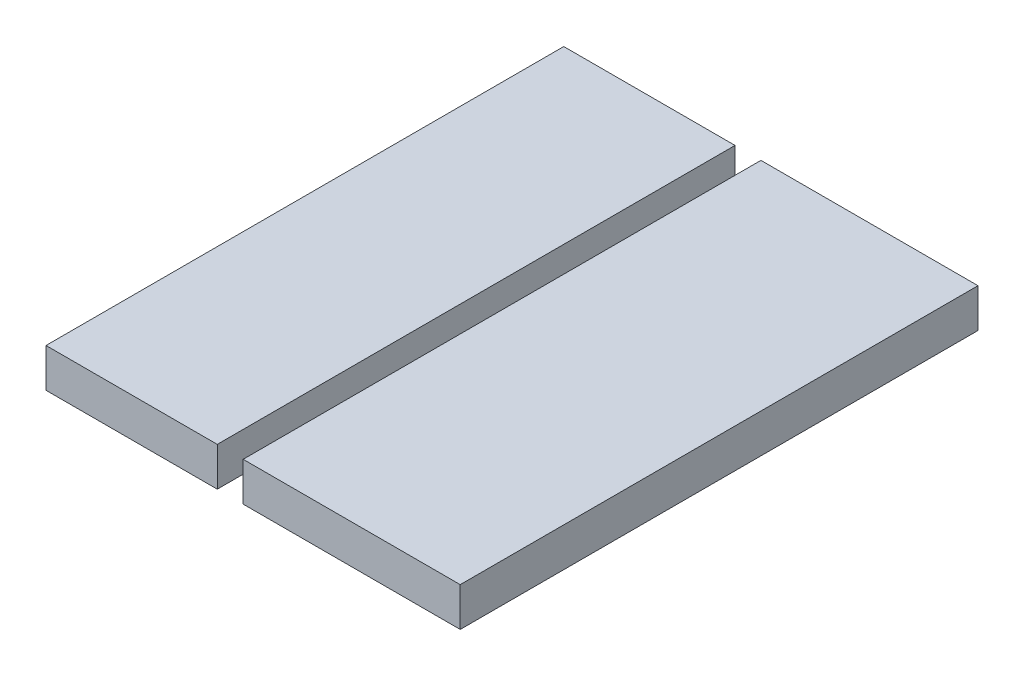
ISO-10303-21;
HEADER;
FILE_DESCRIPTION(('STEP AP214'),'2;1');
FILE_NAME('part.step','',(''),(''),'','','');
FILE_SCHEMA(('AUTOMOTIVE_DESIGN { 1 0 10303 214 1 1 1 1 }'));
ENDSEC;
DATA;
#1=APPLICATION_CONTEXT('core data for automotive mechanical design processes');
#2=APPLICATION_PROTOCOL_DEFINITION('international standard','automotive_design',2000,#1);
#3=PRODUCT_CONTEXT('',#1,'mechanical');
#4=PRODUCT('Part','Part','',(#3));
#5=PRODUCT_RELATED_PRODUCT_CATEGORY('part','',(#4));
#6=PRODUCT_DEFINITION_FORMATION('','',#4);
#7=PRODUCT_DEFINITION_CONTEXT('part definition',#1,'design');
#8=PRODUCT_DEFINITION('design','',#6,#7);
#9=PRODUCT_DEFINITION_SHAPE('','',#8);
#10=(LENGTH_UNIT() NAMED_UNIT(*) SI_UNIT(.MILLI.,.METRE.));
#11=(NAMED_UNIT(*) PLANE_ANGLE_UNIT() SI_UNIT($,.RADIAN.));
#12=(NAMED_UNIT(*) SI_UNIT($,.STERADIAN.) SOLID_ANGLE_UNIT());
#13=UNCERTAINTY_MEASURE_WITH_UNIT(LENGTH_MEASURE(1.E-05),#10,'distance_accuracy_value','');
#14=(GEOMETRIC_REPRESENTATION_CONTEXT(3) GLOBAL_UNCERTAINTY_ASSIGNED_CONTEXT((#13)) GLOBAL_UNIT_ASSIGNED_CONTEXT((#10,
#11,#12)) REPRESENTATION_CONTEXT('',''));
#15=CARTESIAN_POINT('',(0.,0.,0.));
#16=DIRECTION('',(0.,0.,1.));
#17=DIRECTION('',(1.,0.,0.));
#18=AXIS2_PLACEMENT_3D('',#15,#16,#17);
#19=CARTESIAN_POINT('',(28.2085642435462,4.7625,-23.1048774781914));
#20=DIRECTION('',(0.,0.,1.));
#21=DIRECTION('',(1.,0.,0.));
#22=AXIS2_PLACEMENT_3D('',#19,#20,#21);
#23=PLANE('',#22);
#24=DIRECTION('',(-1.,0.,0.));
#25=VECTOR('',#24,1.);
#26=CARTESIAN_POINT('',(28.2085642435462,4.7625,-23.1048774781914));
#27=LINE('',#26,#25);
#28=CARTESIAN_POINT('',(-1.5875,4.7625,-23.1048774781914));
#29=VERTEX_POINT('',#28);
#30=CARTESIAN_POINT('',(-22.5914357564538,4.7625,-23.1048774781914));
#31=VERTEX_POINT('',#30);
#32=EDGE_CURVE('E87',#29,#31,#27,.T.);
#33=ORIENTED_EDGE('',*,*,#32,.F.);
#34=DIRECTION('',(0.,1.,0.));
#35=VECTOR('',#34,1.);
#36=CARTESIAN_POINT('',(-1.5875,-5.2375,-23.1048774781914));
#37=LINE('',#36,#35);
#38=CARTESIAN_POINT('',(-1.5875,0.,-23.1048774781914));
#39=VERTEX_POINT('',#38);
#40=EDGE_CURVE('E51',#39,#29,#37,.T.);
#41=ORIENTED_EDGE('',*,*,#40,.F.);
#42=DIRECTION('',(-1.,0.,0.));
#43=VECTOR('',#42,1.);
#44=CARTESIAN_POINT('',(28.2085642435462,0.,-23.1048774781914));
#45=LINE('',#44,#43);
#46=CARTESIAN_POINT('',(-22.5914357564538,0.,-23.1048774781914));
#47=VERTEX_POINT('',#46);
#48=EDGE_CURVE('E45',#39,#47,#45,.T.);
#49=ORIENTED_EDGE('',*,*,#48,.T.);
#50=DIRECTION('',(0.,-1.,0.));
#51=VECTOR('',#50,1.);
#52=CARTESIAN_POINT('',(-22.5914357564538,4.7625,-23.1048774781914));
#53=LINE('',#52,#51);
#54=EDGE_CURVE('E92',#31,#47,#53,.T.);
#55=ORIENTED_EDGE('',*,*,#54,.F.);
#56=EDGE_LOOP('',(#33,#41,#49,#55));
#57=FACE_BOUND('',#56,.T.);
#58=ADVANCED_FACE('F42',(#57),#23,.F.);
#59=CARTESIAN_POINT('',(28.2085642435462,4.7625,40.3951225218086));
#60=DIRECTION('',(0.,0.,-1.));
#61=DIRECTION('',(-1.,0.,0.));
#62=AXIS2_PLACEMENT_3D('',#59,#60,#61);
#63=PLANE('',#62);
#64=DIRECTION('',(1.,0.,0.));
#65=VECTOR('',#64,1.);
#66=CARTESIAN_POINT('',(28.2085642435462,0.,40.3951225218086));
#67=LINE('',#66,#65);
#68=CARTESIAN_POINT('',(-22.5914357564538,0.,40.3951225218086));
#69=VERTEX_POINT('',#68);
#70=CARTESIAN_POINT('',(-1.5875,0.,40.3951225218086));
#71=VERTEX_POINT('',#70);
#72=EDGE_CURVE('E100',#69,#71,#67,.T.);
#73=ORIENTED_EDGE('',*,*,#72,.T.);
#74=DIRECTION('',(0.,1.,0.));
#75=VECTOR('',#74,1.);
#76=CARTESIAN_POINT('',(-1.5875,-5.2375,40.3951225218086));
#77=LINE('',#76,#75);
#78=CARTESIAN_POINT('',(-1.5875,4.7625,40.3951225218086));
#79=VERTEX_POINT('',#78);
#80=EDGE_CURVE('E58',#71,#79,#77,.T.);
#81=ORIENTED_EDGE('',*,*,#80,.T.);
#82=DIRECTION('',(1.,0.,0.));
#83=VECTOR('',#82,1.);
#84=CARTESIAN_POINT('',(28.2085642435462,4.7625,40.3951225218086));
#85=LINE('',#84,#83);
#86=CARTESIAN_POINT('',(-22.5914357564538,4.7625,40.3951225218086));
#87=VERTEX_POINT('',#86);
#88=EDGE_CURVE('E90',#87,#79,#85,.T.);
#89=ORIENTED_EDGE('',*,*,#88,.F.);
#90=DIRECTION('',(0.,-1.,0.));
#91=VECTOR('',#90,1.);
#92=CARTESIAN_POINT('',(-22.5914357564538,4.7625,40.3951225218086));
#93=LINE('',#92,#91);
#94=EDGE_CURVE('E98',#87,#69,#93,.T.);
#95=ORIENTED_EDGE('',*,*,#94,.T.);
#96=EDGE_LOOP('',(#73,#81,#89,#95));
#97=FACE_BOUND('',#96,.T.);
#98=ADVANCED_FACE('F116',(#97),#63,.F.);
#99=CARTESIAN_POINT('',(28.2085642435462,4.7625,40.3951225218086));
#100=DIRECTION('',(0.,-1.,0.));
#101=DIRECTION('',(0.,0.,-1.));
#102=AXIS2_PLACEMENT_3D('',#99,#100,#101);
#103=PLANE('',#102);
#104=ORIENTED_EDGE('',*,*,#88,.T.);
#105=DIRECTION('',(0.,0.,1.));
#106=VECTOR('',#105,1.);
#107=CARTESIAN_POINT('',(-1.5875,4.7625,-23.1048774781914));
#108=LINE('',#107,#106);
#109=EDGE_CURVE('E12',#29,#79,#108,.T.);
#110=ORIENTED_EDGE('',*,*,#109,.F.);
#111=ORIENTED_EDGE('',*,*,#32,.T.);
#112=DIRECTION('',(0.,0.,1.));
#113=VECTOR('',#112,1.);
#114=CARTESIAN_POINT('',(-22.5914357564538,4.7625,-23.1048774781914));
#115=LINE('',#114,#113);
#116=EDGE_CURVE('E94',#31,#87,#115,.T.);
#117=ORIENTED_EDGE('',*,*,#116,.T.);
#118=EDGE_LOOP('',(#104,#110,#111,#117));
#119=FACE_BOUND('',#118,.T.);
#120=ADVANCED_FACE('F86',(#119),#103,.F.);
#121=CARTESIAN_POINT('',(28.2085642435462,0.,40.3951225218086));
#122=DIRECTION('',(0.,-1.,0.));
#123=DIRECTION('',(0.,0.,-1.));
#124=AXIS2_PLACEMENT_3D('',#121,#122,#123);
#125=PLANE('',#124);
#126=DIRECTION('',(0.,0.,-1.));
#127=VECTOR('',#126,1.);
#128=CARTESIAN_POINT('',(-1.5875,0.,40.3951225218086));
#129=LINE('',#128,#127);
#130=EDGE_CURVE('E79',#71,#39,#129,.T.);
#131=ORIENTED_EDGE('',*,*,#130,.F.);
#132=ORIENTED_EDGE('',*,*,#72,.F.);
#133=DIRECTION('',(0.,0.,1.));
#134=VECTOR('',#133,1.);
#135=CARTESIAN_POINT('',(-22.5914357564538,0.,-23.1048774781914));
#136=LINE('',#135,#134);
#137=EDGE_CURVE('E96',#47,#69,#136,.T.);
#138=ORIENTED_EDGE('',*,*,#137,.F.);
#139=ORIENTED_EDGE('',*,*,#48,.F.);
#140=EDGE_LOOP('',(#131,#132,#138,#139));
#141=FACE_BOUND('',#140,.T.);
#142=ADVANCED_FACE('F112',(#141),#125,.T.);
#143=CARTESIAN_POINT('',(-22.5914357564538,4.7625,-23.1048774781914));
#144=DIRECTION('',(1.,0.,0.));
#145=DIRECTION('',(0.,0.,-1.));
#146=AXIS2_PLACEMENT_3D('',#143,#144,#145);
#147=PLANE('',#146);
#148=ORIENTED_EDGE('',*,*,#137,.T.);
#149=ORIENTED_EDGE('',*,*,#94,.F.);
#150=ORIENTED_EDGE('',*,*,#116,.F.);
#151=ORIENTED_EDGE('',*,*,#54,.T.);
#152=EDGE_LOOP('',(#148,#149,#150,#151));
#153=FACE_BOUND('',#152,.T.);
#154=ADVANCED_FACE('F109',(#153),#147,.F.);
#155=CARTESIAN_POINT('',(-1.5875,-5.2375,-23.1048774781914));
#156=DIRECTION('',(-1.,0.,0.));
#157=DIRECTION('',(0.,0.,1.));
#158=AXIS2_PLACEMENT_3D('',#155,#156,#157);
#159=PLANE('',#158);
#160=ORIENTED_EDGE('',*,*,#130,.T.);
#161=ORIENTED_EDGE('',*,*,#40,.T.);
#162=ORIENTED_EDGE('',*,*,#109,.T.);
#163=ORIENTED_EDGE('',*,*,#80,.F.);
#164=EDGE_LOOP('',(#160,#161,#162,#163));
#165=FACE_BOUND('',#164,.T.);
#166=ADVANCED_FACE('F78',(#165),#159,.F.);
#167=CLOSED_SHELL('',(#58,#98,#120,#142,#154,#166));
#168=MANIFOLD_SOLID_BREP('B2',#167);
#169=CARTESIAN_POINT('',(28.2085642435462,4.7625,-23.1048774781914));
#170=DIRECTION('',(-1.,0.,0.));
#171=DIRECTION('',(0.,0.,1.));
#172=AXIS2_PLACEMENT_3D('',#169,#170,#171);
#173=PLANE('',#172);
#174=DIRECTION('',(0.,0.,-1.));
#175=VECTOR('',#174,1.);
#176=CARTESIAN_POINT('',(28.2085642435462,0.,-23.1048774781914));
#177=LINE('',#176,#175);
#178=CARTESIAN_POINT('',(28.2085642435462,0.,40.3951225218086));
#179=VERTEX_POINT('',#178);
#180=CARTESIAN_POINT('',(28.2085642435462,0.,-23.1048774781914));
#181=VERTEX_POINT('',#180);
#182=EDGE_CURVE('E217',#179,#181,#177,.T.);
#183=ORIENTED_EDGE('',*,*,#182,.T.);
#184=DIRECTION('',(0.,-1.,0.));
#185=VECTOR('',#184,1.);
#186=CARTESIAN_POINT('',(28.2085642435462,4.7625,-23.1048774781914));
#187=LINE('',#186,#185);
#188=CARTESIAN_POINT('',(28.2085642435462,4.7625,-23.1048774781914));
#189=VERTEX_POINT('',#188);
#190=EDGE_CURVE('E173',#189,#181,#187,.T.);
#191=ORIENTED_EDGE('',*,*,#190,.F.);
#192=DIRECTION('',(0.,0.,-1.));
#193=VECTOR('',#192,1.);
#194=CARTESIAN_POINT('',(28.2085642435462,4.7625,-23.1048774781914));
#195=LINE('',#194,#193);
#196=CARTESIAN_POINT('',(28.2085642435462,4.7625,40.3951225218086));
#197=VERTEX_POINT('',#196);
#198=EDGE_CURVE('E211',#197,#189,#195,.T.);
#199=ORIENTED_EDGE('',*,*,#198,.F.);
#200=DIRECTION('',(0.,-1.,0.));
#201=VECTOR('',#200,1.);
#202=CARTESIAN_POINT('',(28.2085642435462,4.7625,40.3951225218086));
#203=LINE('',#202,#201);
#204=EDGE_CURVE('E205',#197,#179,#203,.T.);
#205=ORIENTED_EDGE('',*,*,#204,.T.);
#206=EDGE_LOOP('',(#183,#191,#199,#205));
#207=FACE_BOUND('',#206,.T.);
#208=ADVANCED_FACE('F166',(#207),#173,.F.);
#209=CARTESIAN_POINT('',(28.2085642435462,0.,40.3951225218086));
#210=DIRECTION('',(0.,-1.,0.));
#211=DIRECTION('',(0.,0.,-1.));
#212=AXIS2_PLACEMENT_3D('',#209,#210,#211);
#213=PLANE('',#212);
#214=DIRECTION('',(0.,0.,1.));
#215=VECTOR('',#214,1.);
#216=CARTESIAN_POINT('',(1.5875,0.,40.3951225218086));
#217=LINE('',#216,#215);
#218=CARTESIAN_POINT('',(1.5875,0.,-23.1048774781914));
#219=VERTEX_POINT('',#218);
#220=CARTESIAN_POINT('',(1.58750000000001,0.,40.3951225218086));
#221=VERTEX_POINT('',#220);
#222=EDGE_CURVE('E40',#219,#221,#217,.T.);
#223=ORIENTED_EDGE('',*,*,#222,.F.);
#224=DIRECTION('',(-1.,0.,0.));
#225=VECTOR('',#224,1.);
#226=CARTESIAN_POINT('',(28.2085642435462,0.,-23.1048774781914));
#227=LINE('',#226,#225);
#228=EDGE_CURVE('E212',#181,#219,#227,.T.);
#229=ORIENTED_EDGE('',*,*,#228,.F.);
#230=ORIENTED_EDGE('',*,*,#182,.F.);
#231=DIRECTION('',(1.,0.,0.));
#232=VECTOR('',#231,1.);
#233=CARTESIAN_POINT('',(28.2085642435462,0.,40.3951225218086));
#234=LINE('',#233,#232);
#235=EDGE_CURVE('E202',#221,#179,#234,.T.);
#236=ORIENTED_EDGE('',*,*,#235,.F.);
#237=EDGE_LOOP('',(#223,#229,#230,#236));
#238=FACE_BOUND('',#237,.T.);
#239=ADVANCED_FACE('F219',(#238),#213,.T.);
#240=CARTESIAN_POINT('',(28.2085642435462,4.7625,40.3951225218086));
#241=DIRECTION('',(0.,-1.,0.));
#242=DIRECTION('',(0.,0.,-1.));
#243=AXIS2_PLACEMENT_3D('',#240,#241,#242);
#244=PLANE('',#243);
#245=DIRECTION('',(-1.,0.,0.));
#246=VECTOR('',#245,1.);
#247=CARTESIAN_POINT('',(28.2085642435462,4.7625,-23.1048774781914));
#248=LINE('',#247,#246);
#249=CARTESIAN_POINT('',(1.5875,4.7625,-23.1048774781914));
#250=VERTEX_POINT('',#249);
#251=EDGE_CURVE('E230',#189,#250,#248,.T.);
#252=ORIENTED_EDGE('',*,*,#251,.T.);
#253=DIRECTION('',(0.,0.,-1.));
#254=VECTOR('',#253,1.);
#255=CARTESIAN_POINT('',(1.5875,4.7625,-23.1048774781914));
#256=LINE('',#255,#254);
#257=CARTESIAN_POINT('',(1.58750000000001,4.7625,40.3951225218086));
#258=VERTEX_POINT('',#257);
#259=EDGE_CURVE('E235',#258,#250,#256,.T.);
#260=ORIENTED_EDGE('',*,*,#259,.F.);
#261=DIRECTION('',(1.,0.,0.));
#262=VECTOR('',#261,1.);
#263=CARTESIAN_POINT('',(28.2085642435462,4.7625,40.3951225218086));
#264=LINE('',#263,#262);
#265=EDGE_CURVE('E188',#258,#197,#264,.T.);
#266=ORIENTED_EDGE('',*,*,#265,.T.);
#267=ORIENTED_EDGE('',*,*,#198,.T.);
#268=EDGE_LOOP('',(#252,#260,#266,#267));
#269=FACE_BOUND('',#268,.T.);
#270=ADVANCED_FACE('F232',(#269),#244,.F.);
#271=CARTESIAN_POINT('',(28.2085642435462,4.7625,40.3951225218086));
#272=DIRECTION('',(0.,0.,-1.));
#273=DIRECTION('',(-1.,0.,0.));
#274=AXIS2_PLACEMENT_3D('',#271,#272,#273);
#275=PLANE('',#274);
#276=ORIENTED_EDGE('',*,*,#265,.F.);
#277=DIRECTION('',(0.,1.,0.));
#278=VECTOR('',#277,1.);
#279=CARTESIAN_POINT('',(1.58750000000001,-5.2375,40.3951225218086));
#280=LINE('',#279,#278);
#281=EDGE_CURVE('E208',#221,#258,#280,.T.);
#282=ORIENTED_EDGE('',*,*,#281,.F.);
#283=ORIENTED_EDGE('',*,*,#235,.T.);
#284=ORIENTED_EDGE('',*,*,#204,.F.);
#285=EDGE_LOOP('',(#276,#282,#283,#284));
#286=FACE_BOUND('',#285,.T.);
#287=ADVANCED_FACE('F204',(#286),#275,.F.);
#288=CARTESIAN_POINT('',(28.2085642435462,4.7625,-23.1048774781914));
#289=DIRECTION('',(0.,0.,1.));
#290=DIRECTION('',(1.,0.,0.));
#291=AXIS2_PLACEMENT_3D('',#288,#289,#290);
#292=PLANE('',#291);
#293=ORIENTED_EDGE('',*,*,#228,.T.);
#294=DIRECTION('',(0.,1.,0.));
#295=VECTOR('',#294,1.);
#296=CARTESIAN_POINT('',(1.5875,-5.2375,-23.1048774781914));
#297=LINE('',#296,#295);
#298=EDGE_CURVE('E179',#219,#250,#297,.T.);
#299=ORIENTED_EDGE('',*,*,#298,.T.);
#300=ORIENTED_EDGE('',*,*,#251,.F.);
#301=ORIENTED_EDGE('',*,*,#190,.T.);
#302=EDGE_LOOP('',(#293,#299,#300,#301));
#303=FACE_BOUND('',#302,.T.);
#304=ADVANCED_FACE('F228',(#303),#292,.F.);
#305=CARTESIAN_POINT('',(1.5875,-5.2375,-23.1048774781914));
#306=DIRECTION('',(1.,0.,0.));
#307=DIRECTION('',(0.,0.,-1.));
#308=AXIS2_PLACEMENT_3D('',#305,#306,#307);
#309=PLANE('',#308);
#310=ORIENTED_EDGE('',*,*,#222,.T.);
#311=ORIENTED_EDGE('',*,*,#281,.T.);
#312=ORIENTED_EDGE('',*,*,#259,.T.);
#313=ORIENTED_EDGE('',*,*,#298,.F.);
#314=EDGE_LOOP('',(#310,#311,#312,#313));
#315=FACE_BOUND('',#314,.T.);
#316=ADVANCED_FACE('F237',(#315),#309,.F.);
#317=CLOSED_SHELL('',(#208,#239,#270,#287,#304,#316));
#318=MANIFOLD_SOLID_BREP('B6',#317);
#319=ADVANCED_BREP_SHAPE_REPRESENTATION('',(#18,#168,#318),#14);
#320=SHAPE_DEFINITION_REPRESENTATION(#9,#319);
ENDSEC;
END-ISO-10303-21;
